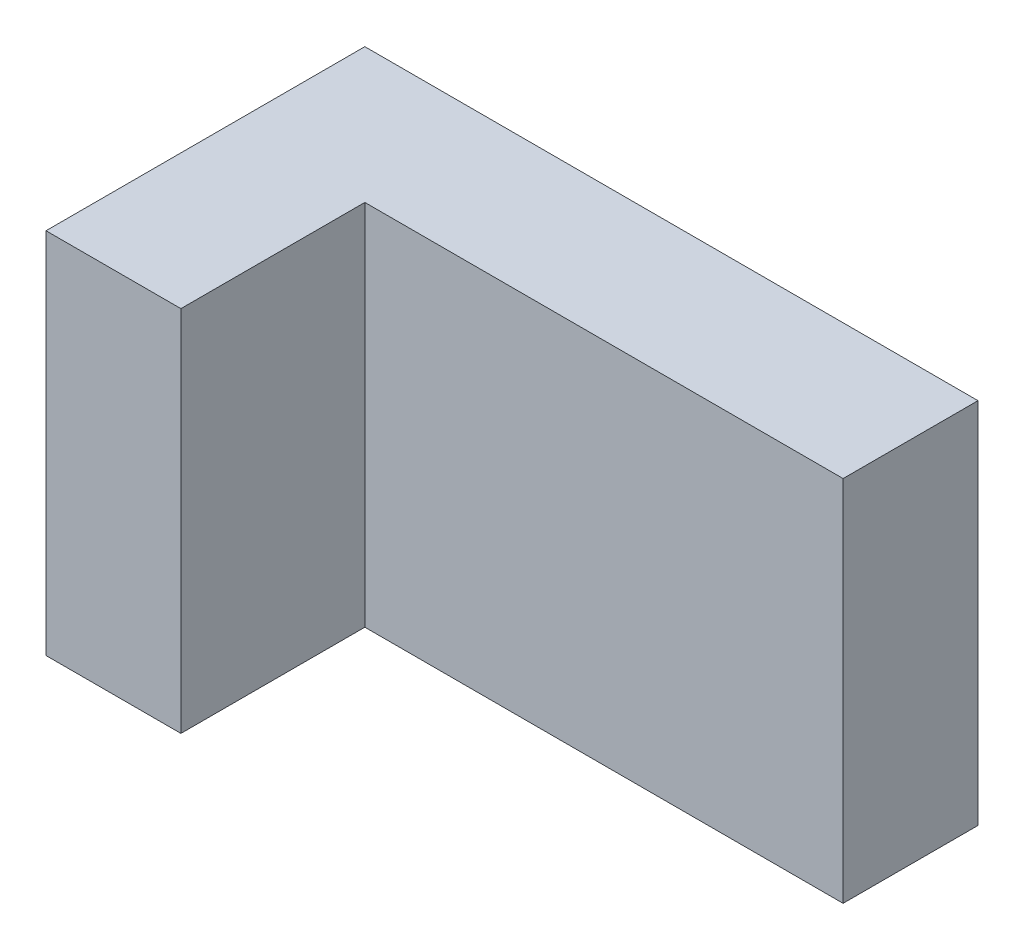
ISO-10303-21;
HEADER;
FILE_DESCRIPTION(('STEP AP214'),'2;1');
FILE_NAME('part.step','',(''),(''),'','','');
FILE_SCHEMA(('AUTOMOTIVE_DESIGN { 1 0 10303 214 1 1 1 1 }'));
ENDSEC;
DATA;
#1=APPLICATION_CONTEXT('core data for automotive mechanical design processes');
#2=APPLICATION_PROTOCOL_DEFINITION('international standard','automotive_design',2000,#1);
#3=PRODUCT_CONTEXT('',#1,'mechanical');
#4=PRODUCT('Part','Part','',(#3));
#5=PRODUCT_RELATED_PRODUCT_CATEGORY('part','',(#4));
#6=PRODUCT_DEFINITION_FORMATION('','',#4);
#7=PRODUCT_DEFINITION_CONTEXT('part definition',#1,'design');
#8=PRODUCT_DEFINITION('design','',#6,#7);
#9=PRODUCT_DEFINITION_SHAPE('','',#8);
#10=(LENGTH_UNIT() NAMED_UNIT(*) SI_UNIT(.MILLI.,.METRE.));
#11=(NAMED_UNIT(*) PLANE_ANGLE_UNIT() SI_UNIT($,.RADIAN.));
#12=(NAMED_UNIT(*) SI_UNIT($,.STERADIAN.) SOLID_ANGLE_UNIT());
#13=UNCERTAINTY_MEASURE_WITH_UNIT(LENGTH_MEASURE(1.E-05),#10,'distance_accuracy_value','');
#14=(GEOMETRIC_REPRESENTATION_CONTEXT(3) GLOBAL_UNCERTAINTY_ASSIGNED_CONTEXT((#13)) GLOBAL_UNIT_ASSIGNED_CONTEXT((#10,
#11,#12)) REPRESENTATION_CONTEXT('',''));
#15=CARTESIAN_POINT('',(0.,0.,0.));
#16=DIRECTION('',(0.,0.,1.));
#17=DIRECTION('',(1.,0.,0.));
#18=AXIS2_PLACEMENT_3D('',#15,#16,#17);
#19=CARTESIAN_POINT('',(-27.4104166666667,17.6385416666667,2.2));
#20=DIRECTION('',(1.,0.,0.));
#21=DIRECTION('',(0.,0.,-1.));
#22=AXIS2_PLACEMENT_3D('',#19,#20,#21);
#23=PLANE('',#22);
#24=DIRECTION('',(0.,-1.,0.));
#25=VECTOR('',#24,1.);
#26=CARTESIAN_POINT('',(-27.4104166666667,17.6385416666667,0.));
#27=LINE('',#26,#25);
#28=CARTESIAN_POINT('',(-27.4104166666667,17.6385416666667,0.));
#29=VERTEX_POINT('',#28);
#30=CARTESIAN_POINT('',(-27.4104166666667,11.6385416666667,0.));
#31=VERTEX_POINT('',#30);
#32=EDGE_CURVE('E97',#29,#31,#27,.T.);
#33=ORIENTED_EDGE('',*,*,#32,.T.);
#34=DIRECTION('',(0.,0.,-1.));
#35=VECTOR('',#34,1.);
#36=CARTESIAN_POINT('',(-27.4104166666667,11.6385416666667,2.2));
#37=LINE('',#36,#35);
#38=CARTESIAN_POINT('',(-27.4104166666667,11.6385416666667,5.2));
#39=VERTEX_POINT('',#38);
#40=EDGE_CURVE('E11',#39,#31,#37,.T.);
#41=ORIENTED_EDGE('',*,*,#40,.F.);
#42=DIRECTION('',(0.,-1.,0.));
#43=VECTOR('',#42,1.);
#44=CARTESIAN_POINT('',(-27.4104166666667,17.6385416666667,5.2));
#45=LINE('',#44,#43);
#46=CARTESIAN_POINT('',(-27.4104166666667,17.6385416666667,5.2));
#47=VERTEX_POINT('',#46);
#48=EDGE_CURVE('E99',#47,#39,#45,.T.);
#49=ORIENTED_EDGE('',*,*,#48,.F.);
#50=DIRECTION('',(0.,0.,-1.));
#51=VECTOR('',#50,1.);
#52=CARTESIAN_POINT('',(-27.4104166666667,17.6385416666667,2.2));
#53=LINE('',#52,#51);
#54=EDGE_CURVE('E83',#47,#29,#53,.T.);
#55=ORIENTED_EDGE('',*,*,#54,.T.);
#56=EDGE_LOOP('',(#33,#41,#49,#55));
#57=FACE_BOUND('',#56,.T.);
#58=ADVANCED_FACE('F39',(#57),#23,.F.);
#59=CARTESIAN_POINT('',(-27.4104166666667,11.6385416666667,2.2));
#60=DIRECTION('',(0.,1.,0.));
#61=DIRECTION('',(0.,0.,1.));
#62=AXIS2_PLACEMENT_3D('',#59,#60,#61);
#63=PLANE('',#62);
#64=DIRECTION('',(1.,0.,0.));
#65=VECTOR('',#64,1.);
#66=CARTESIAN_POINT('',(-27.4104166666667,11.6385416666667,0.));
#67=LINE('',#66,#65);
#68=CARTESIAN_POINT('',(-17.4104166666666,11.6385416666667,0.));
#69=VERTEX_POINT('',#68);
#70=EDGE_CURVE('E103',#31,#69,#67,.T.);
#71=ORIENTED_EDGE('',*,*,#70,.T.);
#72=DIRECTION('',(0.,0.,-1.));
#73=VECTOR('',#72,1.);
#74=CARTESIAN_POINT('',(-17.4104166666666,11.6385416666667,2.2));
#75=LINE('',#74,#73);
#76=CARTESIAN_POINT('',(-17.4104166666666,11.6385416666667,2.2));
#77=VERTEX_POINT('',#76);
#78=EDGE_CURVE('E46',#77,#69,#75,.T.);
#79=ORIENTED_EDGE('',*,*,#78,.F.);
#80=DIRECTION('',(1.,0.,0.));
#81=VECTOR('',#80,1.);
#82=CARTESIAN_POINT('',(-27.4104166666667,11.6385416666667,2.2));
#83=LINE('',#82,#81);
#84=CARTESIAN_POINT('',(-25.2104166666667,11.6385416666667,2.2));
#85=VERTEX_POINT('',#84);
#86=EDGE_CURVE('E90',#85,#77,#83,.T.);
#87=ORIENTED_EDGE('',*,*,#86,.F.);
#88=DIRECTION('',(0.,0.,-1.));
#89=VECTOR('',#88,1.);
#90=CARTESIAN_POINT('',(-25.2104166666667,11.6385416666667,5.2));
#91=LINE('',#90,#89);
#92=CARTESIAN_POINT('',(-25.2104166666667,11.6385416666667,5.2));
#93=VERTEX_POINT('',#92);
#94=EDGE_CURVE('E104',#93,#85,#91,.T.);
#95=ORIENTED_EDGE('',*,*,#94,.F.);
#96=DIRECTION('',(1.,0.,0.));
#97=VECTOR('',#96,1.);
#98=CARTESIAN_POINT('',(-27.4104166666667,11.6385416666667,5.2));
#99=LINE('',#98,#97);
#100=EDGE_CURVE('E124',#39,#93,#99,.T.);
#101=ORIENTED_EDGE('',*,*,#100,.F.);
#102=ORIENTED_EDGE('',*,*,#40,.T.);
#103=EDGE_LOOP('',(#71,#79,#87,#95,#101,#102));
#104=FACE_BOUND('',#103,.T.);
#105=ADVANCED_FACE('F119',(#104),#63,.F.);
#106=CARTESIAN_POINT('',(-17.4104166666666,17.6385416666667,2.2));
#107=DIRECTION('',(-1.,0.,0.));
#108=DIRECTION('',(0.,-1.,0.));
#109=AXIS2_PLACEMENT_3D('',#106,#107,#108);
#110=PLANE('',#109);
#111=DIRECTION('',(0.,1.,0.));
#112=VECTOR('',#111,1.);
#113=CARTESIAN_POINT('',(-17.4104166666666,17.6385416666667,0.));
#114=LINE('',#113,#112);
#115=CARTESIAN_POINT('',(-17.4104166666666,17.6385416666667,0.));
#116=VERTEX_POINT('',#115);
#117=EDGE_CURVE('E91',#69,#116,#114,.T.);
#118=ORIENTED_EDGE('',*,*,#117,.T.);
#119=DIRECTION('',(0.,0.,-1.));
#120=VECTOR('',#119,1.);
#121=CARTESIAN_POINT('',(-17.4104166666666,17.6385416666667,2.2));
#122=LINE('',#121,#120);
#123=CARTESIAN_POINT('',(-17.4104166666666,17.6385416666667,2.2));
#124=VERTEX_POINT('',#123);
#125=EDGE_CURVE('E86',#124,#116,#122,.T.);
#126=ORIENTED_EDGE('',*,*,#125,.F.);
#127=DIRECTION('',(0.,1.,0.));
#128=VECTOR('',#127,1.);
#129=CARTESIAN_POINT('',(-17.4104166666666,17.6385416666667,2.2));
#130=LINE('',#129,#128);
#131=EDGE_CURVE('E59',#77,#124,#130,.T.);
#132=ORIENTED_EDGE('',*,*,#131,.F.);
#133=ORIENTED_EDGE('',*,*,#78,.T.);
#134=EDGE_LOOP('',(#118,#126,#132,#133));
#135=FACE_BOUND('',#134,.T.);
#136=ADVANCED_FACE('F117',(#135),#110,.F.);
#137=CARTESIAN_POINT('',(-27.4104166666667,17.6385416666667,2.2));
#138=DIRECTION('',(0.,-1.,0.));
#139=DIRECTION('',(0.,0.,-1.));
#140=AXIS2_PLACEMENT_3D('',#137,#138,#139);
#141=PLANE('',#140);
#142=DIRECTION('',(-1.,0.,0.));
#143=VECTOR('',#142,1.);
#144=CARTESIAN_POINT('',(-27.4104166666667,17.6385416666667,0.));
#145=LINE('',#144,#143);
#146=EDGE_CURVE('E79',#116,#29,#145,.T.);
#147=ORIENTED_EDGE('',*,*,#146,.T.);
#148=ORIENTED_EDGE('',*,*,#54,.F.);
#149=DIRECTION('',(-1.,0.,0.));
#150=VECTOR('',#149,1.);
#151=CARTESIAN_POINT('',(-27.4104166666667,17.6385416666667,5.2));
#152=LINE('',#151,#150);
#153=CARTESIAN_POINT('',(-25.2104166666667,17.6385416666667,5.2));
#154=VERTEX_POINT('',#153);
#155=EDGE_CURVE('E138',#154,#47,#152,.T.);
#156=ORIENTED_EDGE('',*,*,#155,.F.);
#157=DIRECTION('',(0.,0.,-1.));
#158=VECTOR('',#157,1.);
#159=CARTESIAN_POINT('',(-25.2104166666667,17.6385416666667,5.2));
#160=LINE('',#159,#158);
#161=CARTESIAN_POINT('',(-25.2104166666667,17.6385416666667,2.2));
#162=VERTEX_POINT('',#161);
#163=EDGE_CURVE('E108',#154,#162,#160,.T.);
#164=ORIENTED_EDGE('',*,*,#163,.T.);
#165=DIRECTION('',(-1.,0.,0.));
#166=VECTOR('',#165,1.);
#167=CARTESIAN_POINT('',(-27.4104166666667,17.6385416666667,2.2));
#168=LINE('',#167,#166);
#169=EDGE_CURVE('E100',#124,#162,#168,.T.);
#170=ORIENTED_EDGE('',*,*,#169,.F.);
#171=ORIENTED_EDGE('',*,*,#125,.T.);
#172=EDGE_LOOP('',(#147,#148,#156,#164,#170,#171));
#173=FACE_BOUND('',#172,.T.);
#174=ADVANCED_FACE('F81',(#173),#141,.F.);
#175=CARTESIAN_POINT('',(0.,0.,2.2));
#176=DIRECTION('',(0.,0.,1.));
#177=DIRECTION('',(1.,0.,0.));
#178=AXIS2_PLACEMENT_3D('',#175,#176,#177);
#179=PLANE('',#178);
#180=DIRECTION('',(0.,1.,0.));
#181=VECTOR('',#180,1.);
#182=CARTESIAN_POINT('',(-25.2104166666667,17.6385416666667,2.2));
#183=LINE('',#182,#181);
#184=EDGE_CURVE('E53',#85,#162,#183,.T.);
#185=ORIENTED_EDGE('',*,*,#184,.F.);
#186=ORIENTED_EDGE('',*,*,#86,.T.);
#187=ORIENTED_EDGE('',*,*,#131,.T.);
#188=ORIENTED_EDGE('',*,*,#169,.T.);
#189=EDGE_LOOP('',(#185,#186,#187,#188));
#190=FACE_BOUND('',#189,.T.);
#191=ADVANCED_FACE('F148',(#190),#179,.T.);
#192=CARTESIAN_POINT('',(0.,0.,0.));
#193=DIRECTION('',(0.,0.,1.));
#194=DIRECTION('',(1.,0.,0.));
#195=AXIS2_PLACEMENT_3D('',#192,#193,#194);
#196=PLANE('',#195);
#197=ORIENTED_EDGE('',*,*,#32,.F.);
#198=ORIENTED_EDGE('',*,*,#146,.F.);
#199=ORIENTED_EDGE('',*,*,#117,.F.);
#200=ORIENTED_EDGE('',*,*,#70,.F.);
#201=EDGE_LOOP('',(#197,#198,#199,#200));
#202=FACE_BOUND('',#201,.T.);
#203=ADVANCED_FACE('F102',(#202),#196,.F.);
#204=CARTESIAN_POINT('',(-25.2104166666667,17.6385416666667,5.2));
#205=DIRECTION('',(-1.,0.,0.));
#206=DIRECTION('',(0.,0.,1.));
#207=AXIS2_PLACEMENT_3D('',#204,#205,#206);
#208=PLANE('',#207);
#209=ORIENTED_EDGE('',*,*,#184,.T.);
#210=ORIENTED_EDGE('',*,*,#163,.F.);
#211=DIRECTION('',(0.,1.,0.));
#212=VECTOR('',#211,1.);
#213=CARTESIAN_POINT('',(-25.2104166666667,17.6385416666667,5.2));
#214=LINE('',#213,#212);
#215=EDGE_CURVE('E135',#93,#154,#214,.T.);
#216=ORIENTED_EDGE('',*,*,#215,.F.);
#217=ORIENTED_EDGE('',*,*,#94,.T.);
#218=EDGE_LOOP('',(#209,#210,#216,#217));
#219=FACE_BOUND('',#218,.T.);
#220=ADVANCED_FACE('F142',(#219),#208,.F.);
#221=CARTESIAN_POINT('',(0.,0.,5.2));
#222=DIRECTION('',(0.,0.,1.));
#223=DIRECTION('',(1.,0.,0.));
#224=AXIS2_PLACEMENT_3D('',#221,#222,#223);
#225=PLANE('',#224);
#226=ORIENTED_EDGE('',*,*,#48,.T.);
#227=ORIENTED_EDGE('',*,*,#100,.T.);
#228=ORIENTED_EDGE('',*,*,#215,.T.);
#229=ORIENTED_EDGE('',*,*,#155,.T.);
#230=EDGE_LOOP('',(#226,#227,#228,#229));
#231=FACE_BOUND('',#230,.T.);
#232=ADVANCED_FACE('F137',(#231),#225,.T.);
#233=CLOSED_SHELL('',(#58,#105,#136,#174,#191,#203,#220,#232));
#234=MANIFOLD_SOLID_BREP('B2',#233);
#235=ADVANCED_BREP_SHAPE_REPRESENTATION('',(#18,#234),#14);
#236=SHAPE_DEFINITION_REPRESENTATION(#9,#235);
ENDSEC;
END-ISO-10303-21;
